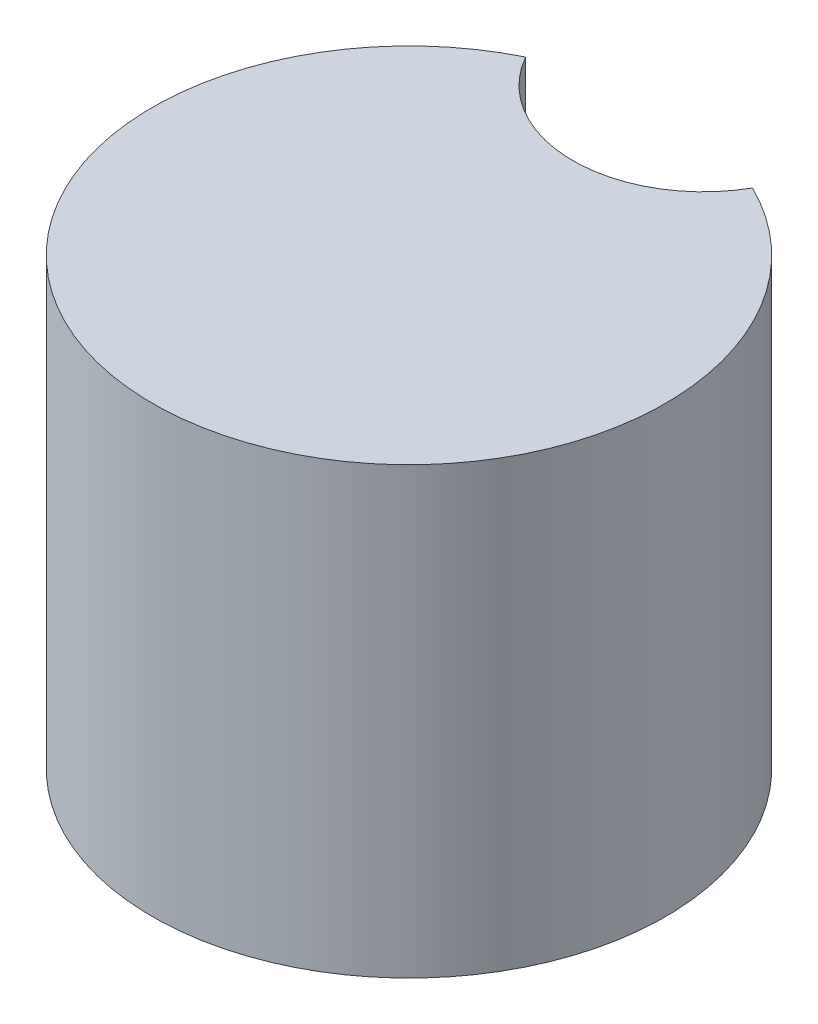
ISO-10303-21;
HEADER;
FILE_DESCRIPTION(('STEP AP214'),'2;1');
FILE_NAME('part.step','',(''),(''),'','','');
FILE_SCHEMA(('AUTOMOTIVE_DESIGN { 1 0 10303 214 1 1 1 1 }'));
ENDSEC;
DATA;
#1=APPLICATION_CONTEXT('core data for automotive mechanical design processes');
#2=APPLICATION_PROTOCOL_DEFINITION('international standard','automotive_design',2000,#1);
#3=PRODUCT_CONTEXT('',#1,'mechanical');
#4=PRODUCT('Part','Part','',(#3));
#5=PRODUCT_RELATED_PRODUCT_CATEGORY('part','',(#4));
#6=PRODUCT_DEFINITION_FORMATION('','',#4);
#7=PRODUCT_DEFINITION_CONTEXT('part definition',#1,'design');
#8=PRODUCT_DEFINITION('design','',#6,#7);
#9=PRODUCT_DEFINITION_SHAPE('','',#8);
#10=(LENGTH_UNIT() NAMED_UNIT(*) SI_UNIT(.MILLI.,.METRE.));
#11=(NAMED_UNIT(*) PLANE_ANGLE_UNIT() SI_UNIT($,.RADIAN.));
#12=(NAMED_UNIT(*) SI_UNIT($,.STERADIAN.) SOLID_ANGLE_UNIT());
#13=UNCERTAINTY_MEASURE_WITH_UNIT(LENGTH_MEASURE(1.E-05),#10,'distance_accuracy_value','');
#14=(GEOMETRIC_REPRESENTATION_CONTEXT(3) GLOBAL_UNCERTAINTY_ASSIGNED_CONTEXT((#13)) GLOBAL_UNIT_ASSIGNED_CONTEXT((#10,
#11,#12)) REPRESENTATION_CONTEXT('',''));
#15=CARTESIAN_POINT('',(0.,0.,0.));
#16=DIRECTION('',(0.,0.,1.));
#17=DIRECTION('',(1.,0.,0.));
#18=AXIS2_PLACEMENT_3D('',#15,#16,#17);
#19=CARTESIAN_POINT('',(0.,130.,0.));
#20=DIRECTION('',(0.,-1.,0.));
#21=DIRECTION('',(0.,0.,-1.));
#22=AXIS2_PLACEMENT_3D('',#19,#20,#21);
#23=CYLINDRICAL_SURFACE('',#22,75.);
#24=CARTESIAN_POINT('',(0.,0.,0.));
#25=DIRECTION('',(0.,1.,0.));
#26=DIRECTION('',(0.,0.,1.));
#27=AXIS2_PLACEMENT_3D('',#24,#25,#26);
#28=CIRCLE('',#27,75.);
#29=CARTESIAN_POINT('',(-33.1605520153102,0.,-67.2709282680112));
#30=VERTEX_POINT('',#29);
#31=CARTESIAN_POINT('',(33.1605520153102,0.,-67.2709282680112));
#32=VERTEX_POINT('',#31);
#33=EDGE_CURVE('E62',#30,#32,#28,.T.);
#34=ORIENTED_EDGE('',*,*,#33,.T.);
#35=DIRECTION('',(0.,1.,0.));
#36=VECTOR('',#35,1.);
#37=CARTESIAN_POINT('',(33.1605520153102,65.,-67.2709282680112));
#38=LINE('',#37,#36);
#39=CARTESIAN_POINT('',(33.1605520153102,130.,-67.2709282680112));
#40=VERTEX_POINT('',#39);
#41=EDGE_CURVE('E47',#32,#40,#38,.T.);
#42=ORIENTED_EDGE('',*,*,#41,.T.);
#43=CARTESIAN_POINT('',(0.,130.,0.));
#44=DIRECTION('',(0.,1.,0.));
#45=DIRECTION('',(0.,0.,1.));
#46=AXIS2_PLACEMENT_3D('',#43,#44,#45);
#47=CIRCLE('',#46,75.);
#48=CARTESIAN_POINT('',(-33.1605520153102,130.,-67.2709282680112));
#49=VERTEX_POINT('',#48);
#50=EDGE_CURVE('E40',#49,#40,#47,.T.);
#51=ORIENTED_EDGE('',*,*,#50,.F.);
#52=DIRECTION('',(0.,1.,0.));
#53=VECTOR('',#52,1.);
#54=CARTESIAN_POINT('',(-33.1605520153102,65.,-67.2709282680112));
#55=LINE('',#54,#53);
#56=EDGE_CURVE('E51',#49,#30,#55,.F.);
#57=ORIENTED_EDGE('',*,*,#56,.T.);
#58=EDGE_LOOP('',(#34,#42,#51,#57));
#59=FACE_BOUND('',#58,.T.);
#60=ADVANCED_FACE('F33',(#59),#23,.T.);
#61=CARTESIAN_POINT('',(0.,130.,0.));
#62=DIRECTION('',(0.,1.,0.));
#63=DIRECTION('',(0.,0.,1.));
#64=AXIS2_PLACEMENT_3D('',#61,#62,#63);
#65=PLANE('',#64);
#66=CARTESIAN_POINT('',(0.,130.,-86.0322659079533));
#67=DIRECTION('',(0.,1.,0.));
#68=DIRECTION('',(0.,0.,1.));
#69=AXIS2_PLACEMENT_3D('',#66,#67,#68);
#70=CIRCLE('',#69,38.1);
#71=EDGE_CURVE('E64',#49,#40,#70,.T.);
#72=ORIENTED_EDGE('',*,*,#71,.F.);
#73=ORIENTED_EDGE('',*,*,#50,.T.);
#74=EDGE_LOOP('',(#72,#73));
#75=FACE_BOUND('',#74,.T.);
#76=ADVANCED_FACE('F71',(#75),#65,.T.);
#77=CARTESIAN_POINT('',(0.,0.,0.));
#78=DIRECTION('',(0.,1.,0.));
#79=DIRECTION('',(0.,0.,1.));
#80=AXIS2_PLACEMENT_3D('',#77,#78,#79);
#81=PLANE('',#80);
#82=ORIENTED_EDGE('',*,*,#33,.F.);
#83=CARTESIAN_POINT('',(0.,0.,-86.0322659079533));
#84=DIRECTION('',(0.,1.,0.));
#85=DIRECTION('',(0.,0.,1.));
#86=AXIS2_PLACEMENT_3D('',#83,#84,#85);
#87=CIRCLE('',#86,38.1);
#88=EDGE_CURVE('E11',#30,#32,#87,.T.);
#89=ORIENTED_EDGE('',*,*,#88,.T.);
#90=EDGE_LOOP('',(#82,#89));
#91=FACE_BOUND('',#90,.T.);
#92=ADVANCED_FACE('F66',(#91),#81,.F.);
#93=CARTESIAN_POINT('',(0.,0.,-86.0322659079533));
#94=DIRECTION('',(0.,1.,0.));
#95=DIRECTION('',(0.,0.,1.));
#96=AXIS2_PLACEMENT_3D('',#93,#94,#95);
#97=CYLINDRICAL_SURFACE('',#96,38.1);
#98=ORIENTED_EDGE('',*,*,#88,.F.);
#99=ORIENTED_EDGE('',*,*,#56,.F.);
#100=ORIENTED_EDGE('',*,*,#71,.T.);
#101=ORIENTED_EDGE('',*,*,#41,.F.);
#102=EDGE_LOOP('',(#98,#99,#100,#101));
#103=FACE_BOUND('',#102,.T.);
#104=ADVANCED_FACE('F56',(#103),#97,.F.);
#105=CLOSED_SHELL('',(#60,#76,#92,#104));
#106=MANIFOLD_SOLID_BREP('B2',#105);
#107=ADVANCED_BREP_SHAPE_REPRESENTATION('',(#18,#106),#14);
#108=SHAPE_DEFINITION_REPRESENTATION(#9,#107);
ENDSEC;
END-ISO-10303-21;
